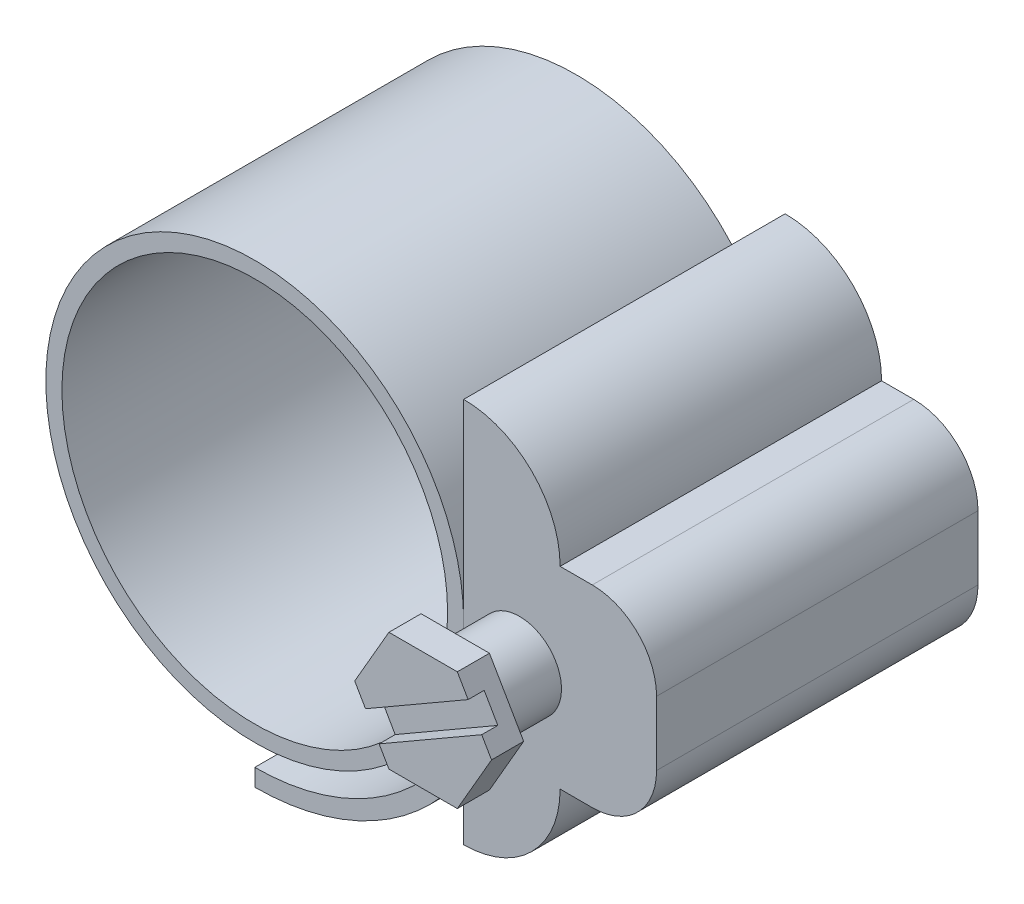
ISO-10303-21;
HEADER;
FILE_DESCRIPTION(('STEP AP214'),'2;1');
FILE_NAME('part.step','',(''),(''),'','','');
FILE_SCHEMA(('AUTOMOTIVE_DESIGN { 1 0 10303 214 1 1 1 1 }'));
ENDSEC;
DATA;
#1=APPLICATION_CONTEXT('core data for automotive mechanical design processes');
#2=APPLICATION_PROTOCOL_DEFINITION('international standard','automotive_design',2000,#1);
#3=PRODUCT_CONTEXT('',#1,'mechanical');
#4=PRODUCT('Part','Part','',(#3));
#5=PRODUCT_RELATED_PRODUCT_CATEGORY('part','',(#4));
#6=PRODUCT_DEFINITION_FORMATION('','',#4);
#7=PRODUCT_DEFINITION_CONTEXT('part definition',#1,'design');
#8=PRODUCT_DEFINITION('design','',#6,#7);
#9=PRODUCT_DEFINITION_SHAPE('','',#8);
#10=(LENGTH_UNIT() NAMED_UNIT(*) SI_UNIT(.MILLI.,.METRE.));
#11=(NAMED_UNIT(*) PLANE_ANGLE_UNIT() SI_UNIT($,.RADIAN.));
#12=(NAMED_UNIT(*) SI_UNIT($,.STERADIAN.) SOLID_ANGLE_UNIT());
#13=UNCERTAINTY_MEASURE_WITH_UNIT(LENGTH_MEASURE(1.E-05),#10,'distance_accuracy_value','');
#14=(GEOMETRIC_REPRESENTATION_CONTEXT(3) GLOBAL_UNCERTAINTY_ASSIGNED_CONTEXT((#13)) GLOBAL_UNIT_ASSIGNED_CONTEXT((#10,
#11,#12)) REPRESENTATION_CONTEXT('',''));
#15=CARTESIAN_POINT('',(0.,0.,0.));
#16=DIRECTION('',(0.,0.,1.));
#17=DIRECTION('',(1.,0.,0.));
#18=AXIS2_PLACEMENT_3D('',#15,#16,#17);
#19=CARTESIAN_POINT('',(6.5,0.,0.));
#20=DIRECTION('',(-1.,0.,0.));
#21=DIRECTION('',(0.,0.,1.));
#22=AXIS2_PLACEMENT_3D('',#19,#20,#21);
#23=PLANE('',#22);
#24=DIRECTION('',(0.,-1.,0.));
#25=VECTOR('',#24,1.);
#26=CARTESIAN_POINT('',(6.5,-6.,0.));
#27=LINE('',#26,#25);
#28=CARTESIAN_POINT('',(6.5,6.,0.));
#29=VERTEX_POINT('',#28);
#30=CARTESIAN_POINT('',(6.5,-3.01376698685739,0.));
#31=VERTEX_POINT('',#30);
#32=EDGE_CURVE('E244',#29,#31,#27,.T.);
#33=ORIENTED_EDGE('',*,*,#32,.T.);
#34=DIRECTION('',(0.,0.,1.));
#35=VECTOR('',#34,1.);
#36=CARTESIAN_POINT('',(6.5,-3.01376698685739,0.));
#37=LINE('',#36,#35);
#38=CARTESIAN_POINT('',(6.5,-3.01376698685739,10.));
#39=VERTEX_POINT('',#38);
#40=EDGE_CURVE('E234',#31,#39,#37,.T.);
#41=ORIENTED_EDGE('',*,*,#40,.T.);
#42=DIRECTION('',(0.,-1.,0.));
#43=VECTOR('',#42,1.);
#44=CARTESIAN_POINT('',(6.5,0.,10.));
#45=LINE('',#44,#43);
#46=CARTESIAN_POINT('',(6.5,6.,10.));
#47=VERTEX_POINT('',#46);
#48=EDGE_CURVE('E245',#47,#39,#45,.T.);
#49=ORIENTED_EDGE('',*,*,#48,.F.);
#50=DIRECTION('',(0.,0.,1.));
#51=VECTOR('',#50,1.);
#52=CARTESIAN_POINT('',(6.5,6.,0.));
#53=LINE('',#52,#51);
#54=EDGE_CURVE('E255',#29,#47,#53,.T.);
#55=ORIENTED_EDGE('',*,*,#54,.F.);
#56=EDGE_LOOP('',(#33,#41,#49,#55));
#57=FACE_BOUND('',#56,.T.);
#58=ADVANCED_FACE('F43',(#57),#23,.T.);
#59=CARTESIAN_POINT('',(0.,0.,13.));
#60=DIRECTION('',(0.,0.,1.));
#61=DIRECTION('',(1.,0.,0.));
#62=AXIS2_PLACEMENT_3D('',#59,#60,#61);
#63=PLANE('',#62);
#64=DIRECTION('',(-0.866025403784434,-0.500000000000007,0.));
#65=VECTOR('',#64,1.);
#66=CARTESIAN_POINT('',(1.98507090058551,-3.43824365644054,13.));
#67=LINE('',#66,#65);
#68=CARTESIAN_POINT('',(9.63721404740159,0.979723249251359,13.));
#69=VERTEX_POINT('',#68);
#70=CARTESIAN_POINT('',(6.44519804693279,-0.863188047876927,13.));
#71=VERTEX_POINT('',#70);
#72=EDGE_CURVE('E466',#69,#71,#67,.T.);
#73=ORIENTED_EDGE('',*,*,#72,.F.);
#74=DIRECTION('',(-0.500000000000001,0.866025403784438,0.));
#75=VECTOR('',#74,1.);
#76=CARTESIAN_POINT('',(10.3655583561704,-0.281806098939796,13.));
#77=LINE('',#76,#75);
#78=CARTESIAN_POINT('',(9.30155302268076,1.56110519818847,13.));
#79=VERTEX_POINT('',#78);
#80=EDGE_CURVE('E483',#69,#79,#77,.T.);
#81=ORIENTED_EDGE('',*,*,#80,.T.);
#82=DIRECTION('',(-1.,0.,0.));
#83=VECTOR('',#82,1.);
#84=CARTESIAN_POINT('',(9.30155302268076,1.56110519818847,13.));
#85=LINE('',#84,#83);
#86=CARTESIAN_POINT('',(7.17354235570155,1.56110519818846,13.));
#87=VERTEX_POINT('',#86);
#88=EDGE_CURVE('E488',#79,#87,#85,.T.);
#89=ORIENTED_EDGE('',*,*,#88,.T.);
#90=DIRECTION('',(-0.499999999999995,-0.866025403784441,0.));
#91=VECTOR('',#90,1.);
#92=CARTESIAN_POINT('',(7.17354235570155,1.56110519818846,13.));
#93=LINE('',#92,#91);
#94=CARTESIAN_POINT('',(6.10953702221195,-0.281806098939811,13.));
#95=VERTEX_POINT('',#94);
#96=EDGE_CURVE('E490',#87,#95,#93,.T.);
#97=ORIENTED_EDGE('',*,*,#96,.T.);
#98=DIRECTION('',(0.500000000000007,-0.866025403784435,0.));
#99=VECTOR('',#98,1.);
#100=CARTESIAN_POINT('',(6.10953702221195,-0.281806098939811,13.));
#101=LINE('',#100,#99);
#102=EDGE_CURVE('E492',#95,#71,#101,.T.);
#103=ORIENTED_EDGE('',*,*,#102,.T.);
#104=EDGE_LOOP('',(#73,#81,#89,#97,#103));
#105=FACE_BOUND('',#104,.T.);
#106=ADVANCED_FACE('F350',(#105),#63,.T.);
#107=CARTESIAN_POINT('',(0.,0.,10.));
#108=DIRECTION('',(0.,0.,-1.));
#109=DIRECTION('',(-1.,0.,0.));
#110=AXIS2_PLACEMENT_3D('',#107,#108,#109);
#111=PLANE('',#110);
#112=ORIENTED_EDGE('',*,*,#48,.T.);
#113=CARTESIAN_POINT('',(0.,0.,10.));
#114=DIRECTION('',(0.,0.,1.));
#115=DIRECTION('',(1.,0.,0.));
#116=AXIS2_PLACEMENT_3D('',#113,#114,#115);
#117=CIRCLE('',#116,7.16469060400179);
#118=CARTESIAN_POINT('',(0.,-7.16469060400179,10.));
#119=VERTEX_POINT('',#118);
#120=EDGE_CURVE('E60',#119,#39,#117,.T.);
#121=ORIENTED_EDGE('',*,*,#120,.F.);
#122=DIRECTION('',(0.,1.,0.));
#123=VECTOR('',#122,1.);
#124=CARTESIAN_POINT('',(0.,0.,10.));
#125=LINE('',#124,#123);
#126=CARTESIAN_POINT('',(0.,-7.69997257823101,10.));
#127=VERTEX_POINT('',#126);
#128=EDGE_CURVE('E226',#127,#119,#125,.T.);
#129=ORIENTED_EDGE('',*,*,#128,.F.);
#130=CARTESIAN_POINT('',(0.,0.,10.));
#131=DIRECTION('',(0.,0.,1.));
#132=DIRECTION('',(1.,0.,0.));
#133=AXIS2_PLACEMENT_3D('',#130,#131,#132);
#134=CIRCLE('',#133,7.69997257823101);
#135=CARTESIAN_POINT('',(6.5,-4.12790233720584,10.));
#136=VERTEX_POINT('',#135);
#137=EDGE_CURVE('E201',#127,#136,#134,.T.);
#138=ORIENTED_EDGE('',*,*,#137,.T.);
#139=CARTESIAN_POINT('',(6.5,-6.,10.));
#140=VERTEX_POINT('',#139);
#141=EDGE_CURVE('E258',#136,#140,#45,.T.);
#142=ORIENTED_EDGE('',*,*,#141,.T.);
#143=CARTESIAN_POINT('',(6.5,-3.,10.));
#144=DIRECTION('',(0.,0.,-1.));
#145=DIRECTION('',(-1.,0.,0.));
#146=AXIS2_PLACEMENT_3D('',#143,#144,#145);
#147=CIRCLE('',#146,3.);
#148=CARTESIAN_POINT('',(9.5,-3.,10.));
#149=VERTEX_POINT('',#148);
#150=EDGE_CURVE('E269',#140,#149,#147,.F.);
#151=ORIENTED_EDGE('',*,*,#150,.T.);
#152=DIRECTION('',(-1.,0.,0.));
#153=VECTOR('',#152,1.);
#154=CARTESIAN_POINT('',(12.5,-3.,10.));
#155=LINE('',#154,#153);
#156=CARTESIAN_POINT('',(10.5,-3.,10.));
#157=VERTEX_POINT('',#156);
#158=EDGE_CURVE('E289',#157,#149,#155,.T.);
#159=ORIENTED_EDGE('',*,*,#158,.F.);
#160=CARTESIAN_POINT('',(10.5,-0.999999999999998,10.));
#161=DIRECTION('',(0.,0.,-1.));
#162=DIRECTION('',(-1.,0.,0.));
#163=AXIS2_PLACEMENT_3D('',#160,#161,#162);
#164=CIRCLE('',#163,2.);
#165=CARTESIAN_POINT('',(12.5,-0.999999999999998,10.));
#166=VERTEX_POINT('',#165);
#167=EDGE_CURVE('E279',#157,#166,#164,.F.);
#168=ORIENTED_EDGE('',*,*,#167,.T.);
#169=DIRECTION('',(0.,-1.,0.));
#170=VECTOR('',#169,1.);
#171=CARTESIAN_POINT('',(12.5,3.,10.));
#172=LINE('',#171,#170);
#173=CARTESIAN_POINT('',(12.5,1.,10.));
#174=VERTEX_POINT('',#173);
#175=EDGE_CURVE('E307',#174,#166,#172,.T.);
#176=ORIENTED_EDGE('',*,*,#175,.F.);
#177=CARTESIAN_POINT('',(10.5,1.,10.));
#178=DIRECTION('',(0.,0.,-1.));
#179=DIRECTION('',(-1.,0.,0.));
#180=AXIS2_PLACEMENT_3D('',#177,#178,#179);
#181=CIRCLE('',#180,2.);
#182=CARTESIAN_POINT('',(10.5,3.,10.));
#183=VERTEX_POINT('',#182);
#184=EDGE_CURVE('E281',#174,#183,#181,.F.);
#185=ORIENTED_EDGE('',*,*,#184,.T.);
#186=DIRECTION('',(-1.,0.,0.));
#187=VECTOR('',#186,1.);
#188=CARTESIAN_POINT('',(12.5,3.,10.));
#189=LINE('',#188,#187);
#190=CARTESIAN_POINT('',(9.5,3.,10.));
#191=VERTEX_POINT('',#190);
#192=EDGE_CURVE('E284',#183,#191,#189,.T.);
#193=ORIENTED_EDGE('',*,*,#192,.T.);
#194=CARTESIAN_POINT('',(6.5,3.,10.));
#195=DIRECTION('',(0.,0.,-1.));
#196=DIRECTION('',(-1.,0.,0.));
#197=AXIS2_PLACEMENT_3D('',#194,#195,#196);
#198=CIRCLE('',#197,3.);
#199=EDGE_CURVE('E273',#191,#47,#198,.F.);
#200=ORIENTED_EDGE('',*,*,#199,.T.);
#201=EDGE_LOOP('',(#112,#121,#129,#138,#142,#151,#159,#168,#176,#185,#193,#200));
#202=FACE_BOUND('',#201,.T.);
#203=CARTESIAN_POINT('',(8.23754768919116,-0.281806098939796,10.));
#204=DIRECTION('',(0.,0.,-1.));
#205=DIRECTION('',(-1.,0.,0.));
#206=AXIS2_PLACEMENT_3D('',#203,#204,#205);
#207=CIRCLE('',#206,1.30408164108251);
#208=CARTESIAN_POINT('',(6.93346604810865,-0.281806098939796,10.));
#209=VERTEX_POINT('',#208);
#210=EDGE_CURVE('E12',#209,#209,#207,.F.);
#211=ORIENTED_EDGE('',*,*,#210,.F.);
#212=EDGE_LOOP('',(#211));
#213=FACE_BOUND('',#212,.T.);
#214=ADVANCED_FACE('F356',(#202,#213),#111,.F.);
#215=DIRECTION('',(0.,0.,1.));
#216=VECTOR('',#215,1.);
#217=CARTESIAN_POINT('',(6.5,-4.12790233720584,0.));
#218=LINE('',#217,#216);
#219=CARTESIAN_POINT('',(6.5,-4.12790233720584,0.));
#220=VERTEX_POINT('',#219);
#221=EDGE_CURVE('E205',#220,#136,#218,.T.);
#222=ORIENTED_EDGE('',*,*,#221,.F.);
#223=CARTESIAN_POINT('',(6.5,-6.,0.));
#224=VERTEX_POINT('',#223);
#225=EDGE_CURVE('E218',#220,#224,#27,.T.);
#226=ORIENTED_EDGE('',*,*,#225,.T.);
#227=DIRECTION('',(0.,0.,1.));
#228=VECTOR('',#227,1.);
#229=CARTESIAN_POINT('',(6.5,-6.,0.));
#230=LINE('',#229,#228);
#231=EDGE_CURVE('E329',#224,#140,#230,.T.);
#232=ORIENTED_EDGE('',*,*,#231,.T.);
#233=ORIENTED_EDGE('',*,*,#141,.F.);
#234=EDGE_LOOP('',(#222,#226,#232,#233));
#235=FACE_BOUND('',#234,.T.);
#236=ADVANCED_FACE('F352',(#235),#23,.T.);
#237=CARTESIAN_POINT('',(0.,0.,0.));
#238=DIRECTION('',(0.,0.,-1.));
#239=DIRECTION('',(-1.,0.,0.));
#240=AXIS2_PLACEMENT_3D('',#237,#238,#239);
#241=PLANE('',#240);
#242=DIRECTION('',(-1.,0.,0.));
#243=VECTOR('',#242,1.);
#244=CARTESIAN_POINT('',(12.5,-3.,0.));
#245=LINE('',#244,#243);
#246=CARTESIAN_POINT('',(10.5,-3.,0.));
#247=VERTEX_POINT('',#246);
#248=CARTESIAN_POINT('',(9.5,-3.,0.));
#249=VERTEX_POINT('',#248);
#250=EDGE_CURVE('E305',#247,#249,#245,.T.);
#251=ORIENTED_EDGE('',*,*,#250,.T.);
#252=CARTESIAN_POINT('',(6.5,-3.,0.));
#253=DIRECTION('',(0.,0.,-1.));
#254=DIRECTION('',(-1.,0.,0.));
#255=AXIS2_PLACEMENT_3D('',#252,#253,#254);
#256=CIRCLE('',#255,3.);
#257=EDGE_CURVE('E52',#249,#224,#256,.T.);
#258=ORIENTED_EDGE('',*,*,#257,.T.);
#259=ORIENTED_EDGE('',*,*,#225,.F.);
#260=CARTESIAN_POINT('',(0.,0.,0.));
#261=DIRECTION('',(0.,0.,1.));
#262=DIRECTION('',(1.,0.,0.));
#263=AXIS2_PLACEMENT_3D('',#260,#261,#262);
#264=CIRCLE('',#263,7.69997257823101);
#265=CARTESIAN_POINT('',(0.,-7.69997257823101,0.));
#266=VERTEX_POINT('',#265);
#267=EDGE_CURVE('E198',#266,#220,#264,.T.);
#268=ORIENTED_EDGE('',*,*,#267,.F.);
#269=DIRECTION('',(0.,1.,0.));
#270=VECTOR('',#269,1.);
#271=CARTESIAN_POINT('',(0.,0.,0.));
#272=LINE('',#271,#270);
#273=CARTESIAN_POINT('',(0.,-7.16469060400179,0.));
#274=VERTEX_POINT('',#273);
#275=EDGE_CURVE('E210',#266,#274,#272,.T.);
#276=ORIENTED_EDGE('',*,*,#275,.T.);
#277=CARTESIAN_POINT('',(0.,0.,0.));
#278=DIRECTION('',(0.,0.,1.));
#279=DIRECTION('',(1.,0.,0.));
#280=AXIS2_PLACEMENT_3D('',#277,#278,#279);
#281=CIRCLE('',#280,7.16469060400179);
#282=EDGE_CURVE('E206',#274,#31,#281,.T.);
#283=ORIENTED_EDGE('',*,*,#282,.T.);
#284=ORIENTED_EDGE('',*,*,#32,.F.);
#285=CARTESIAN_POINT('',(6.5,3.,0.));
#286=DIRECTION('',(0.,0.,-1.));
#287=DIRECTION('',(-1.,0.,0.));
#288=AXIS2_PLACEMENT_3D('',#285,#286,#287);
#289=CIRCLE('',#288,3.);
#290=CARTESIAN_POINT('',(9.5,3.,0.));
#291=VERTEX_POINT('',#290);
#292=EDGE_CURVE('E265',#29,#291,#289,.T.);
#293=ORIENTED_EDGE('',*,*,#292,.T.);
#294=DIRECTION('',(-1.,0.,0.));
#295=VECTOR('',#294,1.);
#296=CARTESIAN_POINT('',(12.5,3.,0.));
#297=LINE('',#296,#295);
#298=CARTESIAN_POINT('',(10.5,3.,0.));
#299=VERTEX_POINT('',#298);
#300=EDGE_CURVE('E288',#299,#291,#297,.T.);
#301=ORIENTED_EDGE('',*,*,#300,.F.);
#302=CARTESIAN_POINT('',(10.5,1.,0.));
#303=DIRECTION('',(0.,0.,-1.));
#304=DIRECTION('',(-1.,0.,0.));
#305=AXIS2_PLACEMENT_3D('',#302,#303,#304);
#306=CIRCLE('',#305,2.);
#307=CARTESIAN_POINT('',(12.5,1.,0.));
#308=VERTEX_POINT('',#307);
#309=EDGE_CURVE('E308',#299,#308,#306,.T.);
#310=ORIENTED_EDGE('',*,*,#309,.T.);
#311=DIRECTION('',(0.,1.,0.));
#312=VECTOR('',#311,1.);
#313=CARTESIAN_POINT('',(12.5,-3.,0.));
#314=LINE('',#313,#312);
#315=CARTESIAN_POINT('',(12.5,-0.999999999999999,0.));
#316=VERTEX_POINT('',#315);
#317=EDGE_CURVE('E378',#316,#308,#314,.T.);
#318=ORIENTED_EDGE('',*,*,#317,.F.);
#319=CARTESIAN_POINT('',(10.5,-0.999999999999999,0.));
#320=DIRECTION('',(0.,0.,-1.));
#321=DIRECTION('',(-1.,0.,0.));
#322=AXIS2_PLACEMENT_3D('',#319,#320,#321);
#323=CIRCLE('',#322,2.);
#324=EDGE_CURVE('E315',#316,#247,#323,.T.);
#325=ORIENTED_EDGE('',*,*,#324,.T.);
#326=EDGE_LOOP('',(#251,#258,#259,#268,#276,#283,#284,#293,#301,#310,#318,#325));
#327=FACE_BOUND('',#326,.T.);
#328=ADVANCED_FACE('F216',(#327),#241,.T.);
#329=CARTESIAN_POINT('',(12.5,3.,0.));
#330=DIRECTION('',(0.,-1.,0.));
#331=DIRECTION('',(1.,0.,0.));
#332=AXIS2_PLACEMENT_3D('',#329,#330,#331);
#333=PLANE('',#332);
#334=ORIENTED_EDGE('',*,*,#192,.F.);
#335=DIRECTION('',(0.,0.,1.));
#336=VECTOR('',#335,1.);
#337=CARTESIAN_POINT('',(10.5,3.,0.));
#338=LINE('',#337,#336);
#339=EDGE_CURVE('E277',#183,#299,#338,.F.);
#340=ORIENTED_EDGE('',*,*,#339,.T.);
#341=ORIENTED_EDGE('',*,*,#300,.T.);
#342=DIRECTION('',(0.,0.,1.));
#343=VECTOR('',#342,1.);
#344=CARTESIAN_POINT('',(9.5,3.,0.));
#345=LINE('',#344,#343);
#346=EDGE_CURVE('E294',#291,#191,#345,.T.);
#347=ORIENTED_EDGE('',*,*,#346,.T.);
#348=EDGE_LOOP('',(#334,#340,#341,#347));
#349=FACE_BOUND('',#348,.T.);
#350=ADVANCED_FACE('F367',(#349),#333,.F.);
#351=CARTESIAN_POINT('',(12.5,-3.,10.));
#352=DIRECTION('',(0.,1.,0.));
#353=DIRECTION('',(-1.,0.,0.));
#354=AXIS2_PLACEMENT_3D('',#351,#352,#353);
#355=PLANE('',#354);
#356=ORIENTED_EDGE('',*,*,#250,.F.);
#357=DIRECTION('',(0.,0.,-1.));
#358=VECTOR('',#357,1.);
#359=CARTESIAN_POINT('',(10.5,-3.,10.));
#360=LINE('',#359,#358);
#361=EDGE_CURVE('E283',#247,#157,#360,.F.);
#362=ORIENTED_EDGE('',*,*,#361,.T.);
#363=ORIENTED_EDGE('',*,*,#158,.T.);
#364=DIRECTION('',(0.,0.,-1.));
#365=VECTOR('',#364,1.);
#366=CARTESIAN_POINT('',(9.5,-3.,10.));
#367=LINE('',#366,#365);
#368=EDGE_CURVE('E297',#149,#249,#367,.T.);
#369=ORIENTED_EDGE('',*,*,#368,.T.);
#370=EDGE_LOOP('',(#356,#362,#363,#369));
#371=FACE_BOUND('',#370,.T.);
#372=ADVANCED_FACE('F401',(#371),#355,.F.);
#373=CARTESIAN_POINT('',(12.5,0.,0.));
#374=DIRECTION('',(1.,0.,0.));
#375=DIRECTION('',(0.,0.,-1.));
#376=AXIS2_PLACEMENT_3D('',#373,#374,#375);
#377=PLANE('',#376);
#378=ORIENTED_EDGE('',*,*,#175,.T.);
#379=DIRECTION('',(0.,0.,-1.));
#380=VECTOR('',#379,1.);
#381=CARTESIAN_POINT('',(12.5,-0.999999999999999,0.));
#382=LINE('',#381,#380);
#383=EDGE_CURVE('E303',#166,#316,#382,.T.);
#384=ORIENTED_EDGE('',*,*,#383,.T.);
#385=ORIENTED_EDGE('',*,*,#317,.T.);
#386=DIRECTION('',(0.,0.,1.));
#387=VECTOR('',#386,1.);
#388=CARTESIAN_POINT('',(12.5,1.,10.));
#389=LINE('',#388,#387);
#390=EDGE_CURVE('E313',#308,#174,#389,.T.);
#391=ORIENTED_EDGE('',*,*,#390,.T.);
#392=EDGE_LOOP('',(#378,#384,#385,#391));
#393=FACE_BOUND('',#392,.T.);
#394=ADVANCED_FACE('F396',(#393),#377,.T.);
#395=CARTESIAN_POINT('',(10.5,-0.999999999999999,0.));
#396=DIRECTION('',(0.,0.,1.));
#397=DIRECTION('',(0.,-1.,0.));
#398=AXIS2_PLACEMENT_3D('',#395,#396,#397);
#399=CYLINDRICAL_SURFACE('',#398,2.);
#400=ORIENTED_EDGE('',*,*,#167,.F.);
#401=ORIENTED_EDGE('',*,*,#361,.F.);
#402=ORIENTED_EDGE('',*,*,#324,.F.);
#403=ORIENTED_EDGE('',*,*,#383,.F.);
#404=EDGE_LOOP('',(#400,#401,#402,#403));
#405=FACE_BOUND('',#404,.T.);
#406=ADVANCED_FACE('F399',(#405),#399,.T.);
#407=CARTESIAN_POINT('',(10.5,1.,0.));
#408=DIRECTION('',(0.,0.,-1.));
#409=DIRECTION('',(0.,1.,0.));
#410=AXIS2_PLACEMENT_3D('',#407,#408,#409);
#411=CYLINDRICAL_SURFACE('',#410,2.);
#412=ORIENTED_EDGE('',*,*,#309,.F.);
#413=ORIENTED_EDGE('',*,*,#339,.F.);
#414=ORIENTED_EDGE('',*,*,#184,.F.);
#415=ORIENTED_EDGE('',*,*,#390,.F.);
#416=EDGE_LOOP('',(#412,#413,#414,#415));
#417=FACE_BOUND('',#416,.T.);
#418=ADVANCED_FACE('F670',(#417),#411,.T.);
#419=CARTESIAN_POINT('',(6.5,-3.,0.));
#420=DIRECTION('',(0.,0.,1.));
#421=DIRECTION('',(1.,0.,0.));
#422=AXIS2_PLACEMENT_3D('',#419,#420,#421);
#423=CYLINDRICAL_SURFACE('',#422,3.);
#424=ORIENTED_EDGE('',*,*,#257,.F.);
#425=ORIENTED_EDGE('',*,*,#368,.F.);
#426=ORIENTED_EDGE('',*,*,#150,.F.);
#427=ORIENTED_EDGE('',*,*,#231,.F.);
#428=EDGE_LOOP('',(#424,#425,#426,#427));
#429=FACE_BOUND('',#428,.T.);
#430=ADVANCED_FACE('F375',(#429),#423,.T.);
#431=CARTESIAN_POINT('',(6.5,3.,0.));
#432=DIRECTION('',(0.,0.,1.));
#433=DIRECTION('',(1.,0.,0.));
#434=AXIS2_PLACEMENT_3D('',#431,#432,#433);
#435=CYLINDRICAL_SURFACE('',#434,3.);
#436=ORIENTED_EDGE('',*,*,#292,.F.);
#437=ORIENTED_EDGE('',*,*,#54,.T.);
#438=ORIENTED_EDGE('',*,*,#199,.F.);
#439=ORIENTED_EDGE('',*,*,#346,.F.);
#440=EDGE_LOOP('',(#436,#437,#438,#439));
#441=FACE_BOUND('',#440,.T.);
#442=ADVANCED_FACE('F45',(#441),#435,.T.);
#443=CARTESIAN_POINT('',(8.23754768919116,-0.281806098939796,12.));
#444=DIRECTION('',(0.,0.,-1.));
#445=DIRECTION('',(-1.,0.,0.));
#446=AXIS2_PLACEMENT_3D('',#443,#444,#445);
#447=CYLINDRICAL_SURFACE('',#446,1.30408164108251);
#448=CARTESIAN_POINT('',(8.23754768919116,-0.281806098939796,12.));
#449=DIRECTION('',(0.,0.,1.));
#450=DIRECTION('',(1.,0.,0.));
#451=AXIS2_PLACEMENT_3D('',#448,#449,#450);
#452=CIRCLE('',#451,1.30408164108251);
#453=CARTESIAN_POINT('',(9.54162933027367,-0.281806098939796,12.));
#454=VERTEX_POINT('',#453);
#455=EDGE_CURVE('E381',#454,#454,#452,.T.);
#456=ORIENTED_EDGE('',*,*,#455,.F.);
#457=EDGE_LOOP('',(#456));
#458=FACE_BOUND('',#457,.T.);
#459=ORIENTED_EDGE('',*,*,#210,.T.);
#460=EDGE_LOOP('',(#459));
#461=FACE_BOUND('',#460,.T.);
#462=ADVANCED_FACE('F411',(#458,#461),#447,.T.);
#463=CARTESIAN_POINT('',(0.,0.,12.));
#464=DIRECTION('',(0.,0.,1.));
#465=DIRECTION('',(1.,0.,0.));
#466=AXIS2_PLACEMENT_3D('',#463,#464,#465);
#467=PLANE('',#466);
#468=DIRECTION('',(0.499999999999995,0.866025403784441,0.));
#469=VECTOR('',#468,1.);
#470=CARTESIAN_POINT('',(9.30155302268079,-2.12471739606804,12.));
#471=LINE('',#470,#469);
#472=CARTESIAN_POINT('',(9.30155302268079,-2.12471739606804,12.));
#473=VERTEX_POINT('',#472);
#474=CARTESIAN_POINT('',(10.3655583561704,-0.281806098939796,12.));
#475=VERTEX_POINT('',#474);
#476=EDGE_CURVE('E498',#473,#475,#471,.T.);
#477=ORIENTED_EDGE('',*,*,#476,.F.);
#478=DIRECTION('',(1.,0.,0.));
#479=VECTOR('',#478,1.);
#480=CARTESIAN_POINT('',(7.17354235570157,-2.12471739606807,12.));
#481=LINE('',#480,#479);
#482=CARTESIAN_POINT('',(7.17354235570157,-2.12471739606807,12.));
#483=VERTEX_POINT('',#482);
#484=EDGE_CURVE('E484',#483,#473,#481,.T.);
#485=ORIENTED_EDGE('',*,*,#484,.F.);
#486=DIRECTION('',(0.500000000000007,-0.866025403784435,0.));
#487=VECTOR('',#486,1.);
#488=CARTESIAN_POINT('',(6.10953702221195,-0.281806098939811,12.));
#489=LINE('',#488,#487);
#490=CARTESIAN_POINT('',(6.10953702221195,-0.281806098939811,12.));
#491=VERTEX_POINT('',#490);
#492=EDGE_CURVE('E508',#491,#483,#489,.T.);
#493=ORIENTED_EDGE('',*,*,#492,.F.);
#494=DIRECTION('',(-0.499999999999995,-0.866025403784441,0.));
#495=VECTOR('',#494,1.);
#496=CARTESIAN_POINT('',(7.17354235570155,1.56110519818846,12.));
#497=LINE('',#496,#495);
#498=CARTESIAN_POINT('',(7.17354235570155,1.56110519818846,12.));
#499=VERTEX_POINT('',#498);
#500=EDGE_CURVE('E506',#499,#491,#497,.T.);
#501=ORIENTED_EDGE('',*,*,#500,.F.);
#502=DIRECTION('',(-1.,0.,0.));
#503=VECTOR('',#502,1.);
#504=CARTESIAN_POINT('',(9.30155302268076,1.56110519818847,12.));
#505=LINE('',#504,#503);
#506=CARTESIAN_POINT('',(9.30155302268076,1.56110519818847,12.));
#507=VERTEX_POINT('',#506);
#508=EDGE_CURVE('E504',#507,#499,#505,.T.);
#509=ORIENTED_EDGE('',*,*,#508,.F.);
#510=DIRECTION('',(-0.500000000000001,0.866025403784438,0.));
#511=VECTOR('',#510,1.);
#512=CARTESIAN_POINT('',(10.3655583561704,-0.281806098939796,12.));
#513=LINE('',#512,#511);
#514=EDGE_CURVE('E501',#475,#507,#513,.T.);
#515=ORIENTED_EDGE('',*,*,#514,.F.);
#516=EDGE_LOOP('',(#477,#485,#493,#501,#509,#515));
#517=FACE_BOUND('',#516,.T.);
#518=ORIENTED_EDGE('',*,*,#455,.T.);
#519=EDGE_LOOP('',(#518));
#520=FACE_BOUND('',#519,.T.);
#521=ADVANCED_FACE('F414',(#517,#520),#467,.F.);
#522=CARTESIAN_POINT('',(9.30155302268079,-2.12471739606804,13.));
#523=DIRECTION('',(-0.866025403784441,0.499999999999995,0.));
#524=DIRECTION('',(-0.499999999999995,-0.866025403784441,0.));
#525=AXIS2_PLACEMENT_3D('',#522,#523,#524);
#526=PLANE('',#525);
#527=ORIENTED_EDGE('',*,*,#476,.T.);
#528=DIRECTION('',(0.,0.,-1.));
#529=VECTOR('',#528,1.);
#530=CARTESIAN_POINT('',(10.3655583561704,-0.281806098939796,13.));
#531=LINE('',#530,#529);
#532=CARTESIAN_POINT('',(10.3655583561704,-0.281806098939796,13.));
#533=VERTEX_POINT('',#532);
#534=EDGE_CURVE('E386',#533,#475,#531,.T.);
#535=ORIENTED_EDGE('',*,*,#534,.F.);
#536=DIRECTION('',(0.499999999999995,0.866025403784441,0.));
#537=VECTOR('',#536,1.);
#538=CARTESIAN_POINT('',(9.30155302268079,-2.12471739606804,13.));
#539=LINE('',#538,#537);
#540=CARTESIAN_POINT('',(9.30155302268079,-2.12471739606804,13.));
#541=VERTEX_POINT('',#540);
#542=EDGE_CURVE('E480',#541,#533,#539,.T.);
#543=ORIENTED_EDGE('',*,*,#542,.F.);
#544=DIRECTION('',(0.,0.,-1.));
#545=VECTOR('',#544,1.);
#546=CARTESIAN_POINT('',(9.30155302268079,-2.12471739606804,13.));
#547=LINE('',#546,#545);
#548=EDGE_CURVE('E497',#541,#473,#547,.T.);
#549=ORIENTED_EDGE('',*,*,#548,.T.);
#550=EDGE_LOOP('',(#527,#535,#543,#549));
#551=FACE_BOUND('',#550,.T.);
#552=ADVANCED_FACE('F416',(#551),#526,.F.);
#553=CARTESIAN_POINT('',(10.3655583561704,-0.281806098939796,13.));
#554=DIRECTION('',(-0.866025403784438,-0.500000000000001,0.));
#555=DIRECTION('',(0.500000000000001,-0.866025403784438,0.));
#556=AXIS2_PLACEMENT_3D('',#553,#554,#555);
#557=PLANE('',#556);
#558=ORIENTED_EDGE('',*,*,#80,.F.);
#559=DIRECTION('',(0.,0.,1.));
#560=VECTOR('',#559,1.);
#561=CARTESIAN_POINT('',(9.63721404740159,0.979723249251359,12.5));
#562=LINE('',#561,#560);
#563=CARTESIAN_POINT('',(9.63721404740159,0.979723249251359,12.5));
#564=VERTEX_POINT('',#563);
#565=EDGE_CURVE('E474',#564,#69,#562,.T.);
#566=ORIENTED_EDGE('',*,*,#565,.F.);
#567=DIRECTION('',(-0.500000000000001,0.866025403784438,0.));
#568=VECTOR('',#567,1.);
#569=CARTESIAN_POINT('',(7.65214314681614,4.41796690569186,12.5));
#570=LINE('',#569,#568);
#571=CARTESIAN_POINT('',(10.0610178751313,0.245673487181382,12.5));
#572=VERTEX_POINT('',#571);
#573=EDGE_CURVE('E476',#572,#564,#570,.T.);
#574=ORIENTED_EDGE('',*,*,#573,.F.);
#575=DIRECTION('',(0.,0.,1.));
#576=VECTOR('',#575,1.);
#577=CARTESIAN_POINT('',(10.0610178751313,0.245673487181382,12.5));
#578=LINE('',#577,#576);
#579=CARTESIAN_POINT('',(10.0610178751313,0.245673487181382,13.));
#580=VERTEX_POINT('',#579);
#581=EDGE_CURVE('E471',#572,#580,#578,.T.);
#582=ORIENTED_EDGE('',*,*,#581,.T.);
#583=EDGE_CURVE('E485',#533,#580,#77,.T.);
#584=ORIENTED_EDGE('',*,*,#583,.F.);
#585=ORIENTED_EDGE('',*,*,#534,.T.);
#586=ORIENTED_EDGE('',*,*,#514,.T.);
#587=DIRECTION('',(0.,0.,-1.));
#588=VECTOR('',#587,1.);
#589=CARTESIAN_POINT('',(9.30155302268076,1.56110519818847,13.));
#590=LINE('',#589,#588);
#591=EDGE_CURVE('E391',#79,#507,#590,.T.);
#592=ORIENTED_EDGE('',*,*,#591,.F.);
#593=EDGE_LOOP('',(#558,#566,#574,#582,#584,#585,#586,#592));
#594=FACE_BOUND('',#593,.T.);
#595=ADVANCED_FACE('F419',(#594),#557,.F.);
#596=CARTESIAN_POINT('',(9.30155302268076,1.56110519818847,13.));
#597=DIRECTION('',(0.,-1.,0.));
#598=DIRECTION('',(1.,0.,0.));
#599=AXIS2_PLACEMENT_3D('',#596,#597,#598);
#600=PLANE('',#599);
#601=ORIENTED_EDGE('',*,*,#508,.T.);
#602=DIRECTION('',(0.,0.,-1.));
#603=VECTOR('',#602,1.);
#604=CARTESIAN_POINT('',(7.17354235570155,1.56110519818846,13.));
#605=LINE('',#604,#603);
#606=EDGE_CURVE('E519',#87,#499,#605,.T.);
#607=ORIENTED_EDGE('',*,*,#606,.F.);
#608=ORIENTED_EDGE('',*,*,#88,.F.);
#609=ORIENTED_EDGE('',*,*,#591,.T.);
#610=EDGE_LOOP('',(#601,#607,#608,#609));
#611=FACE_BOUND('',#610,.T.);
#612=ADVANCED_FACE('F423',(#611),#600,.F.);
#613=CARTESIAN_POINT('',(7.17354235570155,1.56110519818846,13.));
#614=DIRECTION('',(0.866025403784441,-0.499999999999995,0.));
#615=DIRECTION('',(0.499999999999995,0.866025403784442,0.));
#616=AXIS2_PLACEMENT_3D('',#613,#614,#615);
#617=PLANE('',#616);
#618=ORIENTED_EDGE('',*,*,#500,.T.);
#619=DIRECTION('',(0.,0.,-1.));
#620=VECTOR('',#619,1.);
#621=CARTESIAN_POINT('',(6.10953702221195,-0.281806098939811,13.));
#622=LINE('',#621,#620);
#623=EDGE_CURVE('E516',#95,#491,#622,.T.);
#624=ORIENTED_EDGE('',*,*,#623,.F.);
#625=ORIENTED_EDGE('',*,*,#96,.F.);
#626=ORIENTED_EDGE('',*,*,#606,.T.);
#627=EDGE_LOOP('',(#618,#624,#625,#626));
#628=FACE_BOUND('',#627,.T.);
#629=ADVANCED_FACE('F427',(#628),#617,.F.);
#630=CARTESIAN_POINT('',(6.10953702221195,-0.281806098939811,13.));
#631=DIRECTION('',(0.866025403784435,0.500000000000007,0.));
#632=DIRECTION('',(-0.500000000000007,0.866025403784435,0.));
#633=AXIS2_PLACEMENT_3D('',#630,#631,#632);
#634=PLANE('',#633);
#635=DIRECTION('',(0.500000000000007,-0.866025403784435,0.));
#636=VECTOR('',#635,1.);
#637=CARTESIAN_POINT('',(4.46012714634729,2.57505560856361,12.5));
#638=LINE('',#637,#636);
#639=CARTESIAN_POINT('',(6.44519804693279,-0.863188047876927,12.5));
#640=VERTEX_POINT('',#639);
#641=CARTESIAN_POINT('',(6.86900187466247,-1.59723780994688,12.5));
#642=VERTEX_POINT('',#641);
#643=EDGE_CURVE('E460',#640,#642,#638,.T.);
#644=ORIENTED_EDGE('',*,*,#643,.F.);
#645=DIRECTION('',(0.,0.,1.));
#646=VECTOR('',#645,1.);
#647=CARTESIAN_POINT('',(6.44519804693279,-0.863188047876927,12.5));
#648=LINE('',#647,#646);
#649=EDGE_CURVE('E502',#640,#71,#648,.T.);
#650=ORIENTED_EDGE('',*,*,#649,.T.);
#651=ORIENTED_EDGE('',*,*,#102,.F.);
#652=ORIENTED_EDGE('',*,*,#623,.T.);
#653=ORIENTED_EDGE('',*,*,#492,.T.);
#654=DIRECTION('',(0.,0.,-1.));
#655=VECTOR('',#654,1.);
#656=CARTESIAN_POINT('',(7.17354235570157,-2.12471739606807,13.));
#657=LINE('',#656,#655);
#658=CARTESIAN_POINT('',(7.17354235570157,-2.12471739606807,13.));
#659=VERTEX_POINT('',#658);
#660=EDGE_CURVE('E513',#659,#483,#657,.T.);
#661=ORIENTED_EDGE('',*,*,#660,.F.);
#662=CARTESIAN_POINT('',(6.86900187466247,-1.59723780994688,13.));
#663=VERTEX_POINT('',#662);
#664=EDGE_CURVE('E470',#663,#659,#101,.T.);
#665=ORIENTED_EDGE('',*,*,#664,.F.);
#666=DIRECTION('',(0.,0.,1.));
#667=VECTOR('',#666,1.);
#668=CARTESIAN_POINT('',(6.86900187466247,-1.59723780994688,12.5));
#669=LINE('',#668,#667);
#670=EDGE_CURVE('E68',#642,#663,#669,.T.);
#671=ORIENTED_EDGE('',*,*,#670,.F.);
#672=EDGE_LOOP('',(#644,#650,#651,#652,#653,#661,#665,#671));
#673=FACE_BOUND('',#672,.T.);
#674=ADVANCED_FACE('F431',(#673),#634,.F.);
#675=CARTESIAN_POINT('',(7.17354235570157,-2.12471739606807,13.));
#676=DIRECTION('',(0.,1.,0.));
#677=DIRECTION('',(-1.,0.,0.));
#678=AXIS2_PLACEMENT_3D('',#675,#676,#677);
#679=PLANE('',#678);
#680=ORIENTED_EDGE('',*,*,#484,.T.);
#681=ORIENTED_EDGE('',*,*,#548,.F.);
#682=DIRECTION('',(1.,0.,0.));
#683=VECTOR('',#682,1.);
#684=CARTESIAN_POINT('',(7.17354235570157,-2.12471739606807,13.));
#685=LINE('',#684,#683);
#686=EDGE_CURVE('E495',#659,#541,#685,.T.);
#687=ORIENTED_EDGE('',*,*,#686,.F.);
#688=ORIENTED_EDGE('',*,*,#660,.T.);
#689=EDGE_LOOP('',(#680,#681,#687,#688));
#690=FACE_BOUND('',#689,.T.);
#691=ADVANCED_FACE('F435',(#690),#679,.F.);
#692=DIRECTION('',(0.866025403784438,0.500000000000001,0.));
#693=VECTOR('',#692,1.);
#694=CARTESIAN_POINT('',(2.40887472831513,-4.17229341851047,13.));
#695=LINE('',#694,#693);
#696=EDGE_CURVE('E233',#663,#580,#695,.T.);
#697=ORIENTED_EDGE('',*,*,#696,.F.);
#698=ORIENTED_EDGE('',*,*,#664,.T.);
#699=ORIENTED_EDGE('',*,*,#686,.T.);
#700=ORIENTED_EDGE('',*,*,#542,.T.);
#701=ORIENTED_EDGE('',*,*,#583,.T.);
#702=EDGE_LOOP('',(#697,#698,#699,#700,#701));
#703=FACE_BOUND('',#702,.T.);
#704=ADVANCED_FACE('F359',(#703),#63,.T.);
#705=CARTESIAN_POINT('',(1.98507090058551,-3.43824365644054,12.5));
#706=DIRECTION('',(-0.500000000000007,0.866025403784434,0.));
#707=DIRECTION('',(-0.866025403784434,-0.500000000000007,0.));
#708=AXIS2_PLACEMENT_3D('',#705,#706,#707);
#709=PLANE('',#708);
#710=ORIENTED_EDGE('',*,*,#72,.T.);
#711=ORIENTED_EDGE('',*,*,#649,.F.);
#712=DIRECTION('',(-0.866025403784434,-0.500000000000007,0.));
#713=VECTOR('',#712,1.);
#714=CARTESIAN_POINT('',(1.98507090058551,-3.43824365644054,12.5));
#715=LINE('',#714,#713);
#716=EDGE_CURVE('E464',#564,#640,#715,.T.);
#717=ORIENTED_EDGE('',*,*,#716,.F.);
#718=ORIENTED_EDGE('',*,*,#565,.T.);
#719=EDGE_LOOP('',(#710,#711,#717,#718));
#720=FACE_BOUND('',#719,.T.);
#721=ADVANCED_FACE('F444',(#720),#709,.F.);
#722=CARTESIAN_POINT('',(2.40887472831513,-4.17229341851047,12.5));
#723=DIRECTION('',(0.500000000000001,-0.866025403784438,0.));
#724=DIRECTION('',(0.866025403784438,0.500000000000001,0.));
#725=AXIS2_PLACEMENT_3D('',#722,#723,#724);
#726=PLANE('',#725);
#727=ORIENTED_EDGE('',*,*,#696,.T.);
#728=ORIENTED_EDGE('',*,*,#581,.F.);
#729=DIRECTION('',(0.866025403784438,0.500000000000001,0.));
#730=VECTOR('',#729,1.);
#731=CARTESIAN_POINT('',(2.40887472831513,-4.17229341851047,12.5));
#732=LINE('',#731,#730);
#733=EDGE_CURVE('E461',#642,#572,#732,.T.);
#734=ORIENTED_EDGE('',*,*,#733,.F.);
#735=ORIENTED_EDGE('',*,*,#670,.T.);
#736=EDGE_LOOP('',(#727,#728,#734,#735));
#737=FACE_BOUND('',#736,.T.);
#738=ADVANCED_FACE('F446',(#737),#726,.F.);
#739=CARTESIAN_POINT('',(0.,0.,12.5));
#740=DIRECTION('',(0.,0.,1.));
#741=DIRECTION('',(1.,0.,0.));
#742=AXIS2_PLACEMENT_3D('',#739,#740,#741);
#743=PLANE('',#742);
#744=ORIENTED_EDGE('',*,*,#643,.T.);
#745=ORIENTED_EDGE('',*,*,#733,.T.);
#746=ORIENTED_EDGE('',*,*,#573,.T.);
#747=ORIENTED_EDGE('',*,*,#716,.T.);
#748=EDGE_LOOP('',(#744,#745,#746,#747));
#749=FACE_BOUND('',#748,.T.);
#750=ADVANCED_FACE('F347',(#749),#743,.T.);
#751=CARTESIAN_POINT('',(0.,0.,0.));
#752=DIRECTION('',(1.,0.,0.));
#753=DIRECTION('',(0.,0.,-1.));
#754=AXIS2_PLACEMENT_3D('',#751,#752,#753);
#755=PLANE('',#754);
#756=ORIENTED_EDGE('',*,*,#128,.T.);
#757=DIRECTION('',(0.,0.,1.));
#758=VECTOR('',#757,1.);
#759=CARTESIAN_POINT('',(0.,-7.16469060400179,0.));
#760=LINE('',#759,#758);
#761=EDGE_CURVE('E212',#274,#119,#760,.T.);
#762=ORIENTED_EDGE('',*,*,#761,.F.);
#763=ORIENTED_EDGE('',*,*,#275,.F.);
#764=DIRECTION('',(0.,0.,1.));
#765=VECTOR('',#764,1.);
#766=CARTESIAN_POINT('',(0.,-7.69997257823101,0.));
#767=LINE('',#766,#765);
#768=EDGE_CURVE('E194',#266,#127,#767,.T.);
#769=ORIENTED_EDGE('',*,*,#768,.T.);
#770=EDGE_LOOP('',(#756,#762,#763,#769));
#771=FACE_BOUND('',#770,.T.);
#772=ADVANCED_FACE('F211',(#771),#755,.F.);
#773=CARTESIAN_POINT('',(0.,0.,0.));
#774=DIRECTION('',(0.,0.,1.));
#775=DIRECTION('',(1.,0.,0.));
#776=AXIS2_PLACEMENT_3D('',#773,#774,#775);
#777=CYLINDRICAL_SURFACE('',#776,7.16469060400179);
#778=ORIENTED_EDGE('',*,*,#120,.T.);
#779=ORIENTED_EDGE('',*,*,#40,.F.);
#780=ORIENTED_EDGE('',*,*,#282,.F.);
#781=ORIENTED_EDGE('',*,*,#761,.T.);
#782=EDGE_LOOP('',(#778,#779,#780,#781));
#783=FACE_BOUND('',#782,.T.);
#784=ADVANCED_FACE('F339',(#783),#777,.F.);
#785=CARTESIAN_POINT('',(0.,0.,0.));
#786=DIRECTION('',(0.,0.,1.));
#787=DIRECTION('',(1.,0.,0.));
#788=AXIS2_PLACEMENT_3D('',#785,#786,#787);
#789=CYLINDRICAL_SURFACE('',#788,7.69997257823101);
#790=ORIENTED_EDGE('',*,*,#137,.F.);
#791=ORIENTED_EDGE('',*,*,#768,.F.);
#792=ORIENTED_EDGE('',*,*,#267,.T.);
#793=ORIENTED_EDGE('',*,*,#221,.T.);
#794=EDGE_LOOP('',(#790,#791,#792,#793));
#795=FACE_BOUND('',#794,.T.);
#796=ADVANCED_FACE('F196',(#795),#789,.T.);
#797=CLOSED_SHELL('',(#58,#106,#214,#236,#328,#350,#372,#394,#406,#418,#430,#442,#462,#521,#552,
#595,#612,#629,#674,#691,#704,#721,#738,#750,#772,#784,#796));
#798=MANIFOLD_SOLID_BREP('B2',#797);
#799=CARTESIAN_POINT('',(0.,0.,10.));
#800=DIRECTION('',(0.,0.,1.));
#801=DIRECTION('',(1.,0.,0.));
#802=AXIS2_PLACEMENT_3D('',#799,#800,#801);
#803=PLANE('',#802);
#804=CARTESIAN_POINT('',(0.,0.,10.));
#805=DIRECTION('',(0.,0.,1.));
#806=DIRECTION('',(1.,0.,0.));
#807=AXIS2_PLACEMENT_3D('',#804,#805,#806);
#808=CIRCLE('',#807,6.5);
#809=CARTESIAN_POINT('',(6.5,0.,10.));
#810=VERTEX_POINT('',#809);
#811=EDGE_CURVE('E42',#810,#810,#808,.T.);
#812=ORIENTED_EDGE('',*,*,#811,.T.);
#813=EDGE_LOOP('',(#812));
#814=FACE_BOUND('',#813,.T.);
#815=CARTESIAN_POINT('',(0.,0.,10.));
#816=DIRECTION('',(0.,0.,1.));
#817=DIRECTION('',(1.,0.,0.));
#818=AXIS2_PLACEMENT_3D('',#815,#816,#817);
#819=CIRCLE('',#818,6.);
#820=CARTESIAN_POINT('',(6.,0.,10.));
#821=VERTEX_POINT('',#820);
#822=EDGE_CURVE('E742',#821,#821,#819,.T.);
#823=ORIENTED_EDGE('',*,*,#822,.F.);
#824=EDGE_LOOP('',(#823));
#825=FACE_BOUND('',#824,.T.);
#826=ADVANCED_FACE('F731',(#814,#825),#803,.T.);
#827=CARTESIAN_POINT('',(0.,0.,0.));
#828=DIRECTION('',(0.,0.,1.));
#829=DIRECTION('',(1.,0.,0.));
#830=AXIS2_PLACEMENT_3D('',#827,#828,#829);
#831=PLANE('',#830);
#832=CARTESIAN_POINT('',(0.,0.,0.));
#833=DIRECTION('',(0.,0.,1.));
#834=DIRECTION('',(1.,0.,0.));
#835=AXIS2_PLACEMENT_3D('',#832,#833,#834);
#836=CIRCLE('',#835,6.5);
#837=CARTESIAN_POINT('',(6.5,0.,0.));
#838=VERTEX_POINT('',#837);
#839=EDGE_CURVE('E735',#838,#838,#836,.T.);
#840=ORIENTED_EDGE('',*,*,#839,.F.);
#841=EDGE_LOOP('',(#840));
#842=FACE_BOUND('',#841,.T.);
#843=CARTESIAN_POINT('',(0.,0.,0.));
#844=DIRECTION('',(0.,0.,1.));
#845=DIRECTION('',(1.,0.,0.));
#846=AXIS2_PLACEMENT_3D('',#843,#844,#845);
#847=CIRCLE('',#846,6.);
#848=CARTESIAN_POINT('',(6.,0.,0.));
#849=VERTEX_POINT('',#848);
#850=EDGE_CURVE('E744',#849,#849,#847,.T.);
#851=ORIENTED_EDGE('',*,*,#850,.T.);
#852=EDGE_LOOP('',(#851));
#853=FACE_BOUND('',#852,.T.);
#854=ADVANCED_FACE('F754',(#842,#853),#831,.F.);
#855=CARTESIAN_POINT('',(0.,0.,10.));
#856=DIRECTION('',(0.,0.,-1.));
#857=DIRECTION('',(-1.,0.,0.));
#858=AXIS2_PLACEMENT_3D('',#855,#856,#857);
#859=CYLINDRICAL_SURFACE('',#858,6.5);
#860=ORIENTED_EDGE('',*,*,#811,.F.);
#861=EDGE_LOOP('',(#860));
#862=FACE_BOUND('',#861,.T.);
#863=ORIENTED_EDGE('',*,*,#839,.T.);
#864=EDGE_LOOP('',(#863));
#865=FACE_BOUND('',#864,.T.);
#866=ADVANCED_FACE('F733',(#862,#865),#859,.T.);
#867=CARTESIAN_POINT('',(0.,0.,10.));
#868=DIRECTION('',(0.,0.,-1.));
#869=DIRECTION('',(-1.,0.,0.));
#870=AXIS2_PLACEMENT_3D('',#867,#868,#869);
#871=CYLINDRICAL_SURFACE('',#870,6.);
#872=ORIENTED_EDGE('',*,*,#822,.T.);
#873=EDGE_LOOP('',(#872));
#874=FACE_BOUND('',#873,.T.);
#875=ORIENTED_EDGE('',*,*,#850,.F.);
#876=EDGE_LOOP('',(#875));
#877=FACE_BOUND('',#876,.T.);
#878=ADVANCED_FACE('F750',(#874,#877),#871,.F.);
#879=CLOSED_SHELL('',(#826,#854,#866,#878));
#880=MANIFOLD_SOLID_BREP('B6',#879);
#881=ADVANCED_BREP_SHAPE_REPRESENTATION('',(#18,#798,#880),#14);
#882=SHAPE_DEFINITION_REPRESENTATION(#9,#881);
ENDSEC;
END-ISO-10303-21;
